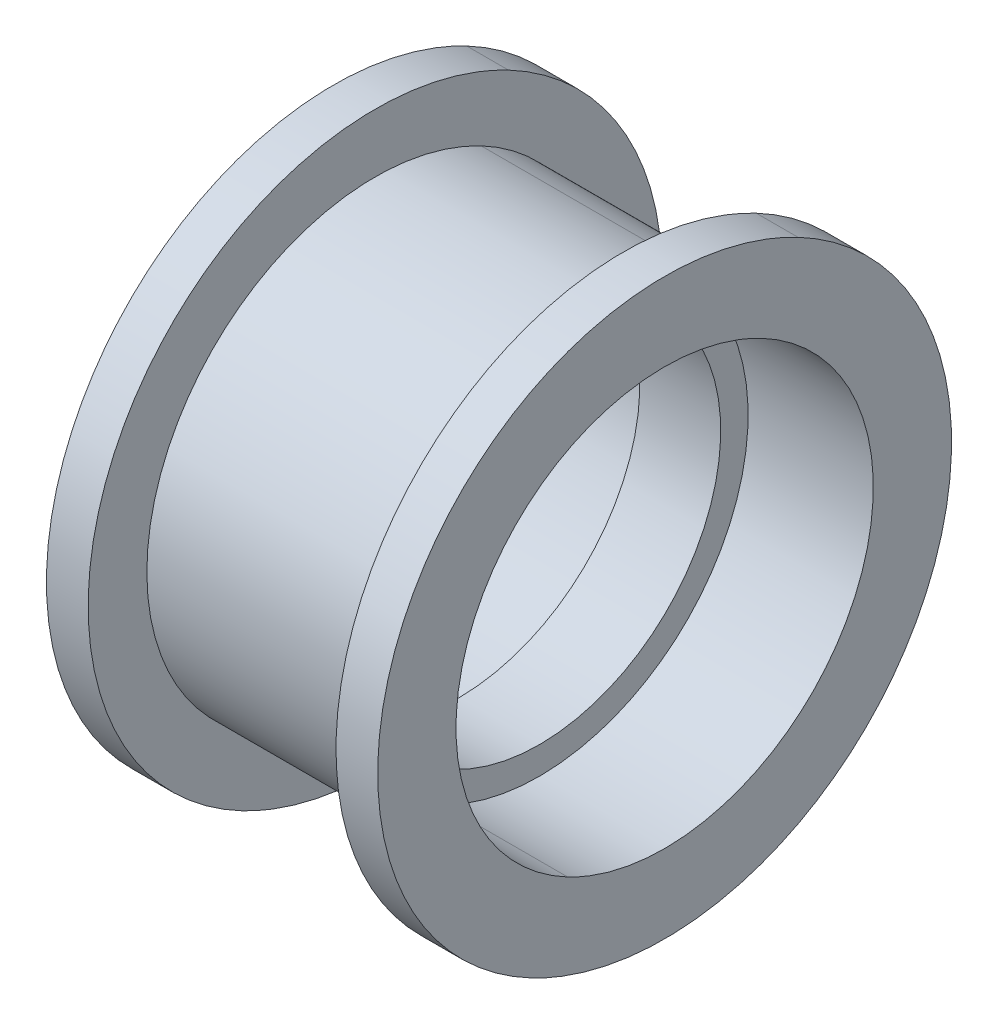
ISO-10303-21;
HEADER;
FILE_DESCRIPTION(('STEP AP214'),'2;1');
FILE_NAME('part.step','',(''),(''),'','','');
FILE_SCHEMA(('AUTOMOTIVE_DESIGN { 1 0 10303 214 1 1 1 1 }'));
ENDSEC;
DATA;
#1=APPLICATION_CONTEXT('core data for automotive mechanical design processes');
#2=APPLICATION_PROTOCOL_DEFINITION('international standard','automotive_design',2000,#1);
#3=PRODUCT_CONTEXT('',#1,'mechanical');
#4=PRODUCT('Part','Part','',(#3));
#5=PRODUCT_RELATED_PRODUCT_CATEGORY('part','',(#4));
#6=PRODUCT_DEFINITION_FORMATION('','',#4);
#7=PRODUCT_DEFINITION_CONTEXT('part definition',#1,'design');
#8=PRODUCT_DEFINITION('design','',#6,#7);
#9=PRODUCT_DEFINITION_SHAPE('','',#8);
#10=(LENGTH_UNIT() NAMED_UNIT(*) SI_UNIT(.MILLI.,.METRE.));
#11=(NAMED_UNIT(*) PLANE_ANGLE_UNIT() SI_UNIT($,.RADIAN.));
#12=(NAMED_UNIT(*) SI_UNIT($,.STERADIAN.) SOLID_ANGLE_UNIT());
#13=UNCERTAINTY_MEASURE_WITH_UNIT(LENGTH_MEASURE(1.E-05),#10,'distance_accuracy_value','');
#14=(GEOMETRIC_REPRESENTATION_CONTEXT(3) GLOBAL_UNCERTAINTY_ASSIGNED_CONTEXT((#13)) GLOBAL_UNIT_ASSIGNED_CONTEXT((#10,
#11,#12)) REPRESENTATION_CONTEXT('',''));
#15=CARTESIAN_POINT('',(0.,0.,0.));
#16=DIRECTION('',(0.,0.,1.));
#17=DIRECTION('',(1.,0.,0.));
#18=AXIS2_PLACEMENT_3D('',#15,#16,#17);
#19=CARTESIAN_POINT('',(195.265281719252,-140.484513661955,253.599848351443));
#20=CARTESIAN_POINT('',(195.265281719252,-136.765971166813,260.683099138463));
#21=CARTESIAN_POINT('',(195.265281719252,-129.682720379793,256.964556643321));
#22=CARTESIAN_POINT('',(195.265281719252,-122.599469592772,253.24601414818));
#23=CARTESIAN_POINT('',(195.265281719252,-126.318012087914,246.162763361159));
#24=CARTESIAN_POINT('',(190.465281719252,-140.484513661955,253.599848351443));
#25=CARTESIAN_POINT('',(190.465281719252,-136.765971166813,260.683099138463));
#26=CARTESIAN_POINT('',(190.465281719252,-129.682720379793,256.964556643321));
#27=CARTESIAN_POINT('',(190.465281719252,-122.599469592772,253.24601414818));
#28=CARTESIAN_POINT('',(190.465281719252,-126.318012087914,246.162763361159));
#29=(BOUNDED_SURFACE() B_SPLINE_SURFACE(1,2,((#19,#20,#21,#22,#23),(#24,#25,#26,#27,#28)),
.UNSPECIFIED.,.F.,.F.,.F.) B_SPLINE_SURFACE_WITH_KNOTS((2,2),(3,2,3),(-6.35,-1.55),
(1.5707963267949,3.14159265358979,4.71238898038469),
.UNSPECIFIED.) GEOMETRIC_REPRESENTATION_ITEM() RATIONAL_B_SPLINE_SURFACE(((1.,0.707106781186548,
1.,0.707106781186548,1.),(1.,0.707106781186548,1.,0.707106781186548,1.))) REPRESENTATION_ITEM('') SURFACE());
#30=CARTESIAN_POINT('',(195.265281719252,-126.318012087914,246.162763361159));
#31=CARTESIAN_POINT('',(190.465281719252,-126.318012087914,246.162763361159));
#32=(BOUNDED_CURVE() B_SPLINE_CURVE(1,(#30,#31),.UNSPECIFIED.,.F.,
.F.) B_SPLINE_CURVE_WITH_KNOTS((2,2),(0.,4.8),
.UNSPECIFIED.) CURVE() GEOMETRIC_REPRESENTATION_ITEM() RATIONAL_B_SPLINE_CURVE((1.,1.)) REPRESENTATION_ITEM(''));
#33=CARTESIAN_POINT('',(195.265281719252,-126.318012087914,246.162763361159));
#34=VERTEX_POINT('',#33);
#35=CARTESIAN_POINT('',(190.465281719252,-126.318012087914,246.162763361159));
#36=VERTEX_POINT('',#35);
#37=EDGE_CURVE('E63',#34,#36,#32,.T.);
#38=CARTESIAN_POINT('',(195.265281719252,-140.484513661955,253.599848351443));
#39=CARTESIAN_POINT('',(195.265281719252,-136.765971166813,260.683099138463));
#40=CARTESIAN_POINT('',(195.265281719252,-129.682720379793,256.964556643321));
#41=CARTESIAN_POINT('',(195.265281719252,-122.599469592772,253.24601414818));
#42=CARTESIAN_POINT('',(195.265281719252,-126.318012087914,246.162763361159));
#43=(BOUNDED_CURVE() B_SPLINE_CURVE(2,(#38,#39,#40,#41,#42),.UNSPECIFIED.,.F.,
.F.) B_SPLINE_CURVE_WITH_KNOTS((3,2,3),(0.,12.5663706143592,25.1327412287183),
.UNSPECIFIED.) CURVE() GEOMETRIC_REPRESENTATION_ITEM() RATIONAL_B_SPLINE_CURVE((1.,
0.707106781186548,1.,0.707106781186548,1.)) REPRESENTATION_ITEM(''));
#44=CARTESIAN_POINT('',(195.265281719252,-140.484513661955,253.599848351443));
#45=VERTEX_POINT('',#44);
#46=EDGE_CURVE('E421',#45,#34,#43,.T.);
#47=CARTESIAN_POINT('',(195.265281719252,-140.484513661955,253.599848351443));
#48=CARTESIAN_POINT('',(190.465281719252,-140.484513661955,253.599848351443));
#49=(BOUNDED_CURVE() B_SPLINE_CURVE(1,(#47,#48),.UNSPECIFIED.,.F.,
.F.) B_SPLINE_CURVE_WITH_KNOTS((2,2),(0.,4.8),
.UNSPECIFIED.) CURVE() GEOMETRIC_REPRESENTATION_ITEM() RATIONAL_B_SPLINE_CURVE((1.,1.)) REPRESENTATION_ITEM(''));
#50=CARTESIAN_POINT('',(190.465281719252,-140.484513661955,253.599848351443));
#51=VERTEX_POINT('',#50);
#52=EDGE_CURVE('E11',#45,#51,#49,.T.);
#53=CARTESIAN_POINT('',(190.465281719252,-140.484513661955,253.599848351443));
#54=CARTESIAN_POINT('',(190.465281719252,-136.765971166813,260.683099138463));
#55=CARTESIAN_POINT('',(190.465281719252,-129.682720379793,256.964556643321));
#56=CARTESIAN_POINT('',(190.465281719252,-122.599469592772,253.24601414818));
#57=CARTESIAN_POINT('',(190.465281719252,-126.318012087914,246.162763361159));
#58=(BOUNDED_CURVE() B_SPLINE_CURVE(2,(#53,#54,#55,#56,#57),.UNSPECIFIED.,.F.,
.F.) B_SPLINE_CURVE_WITH_KNOTS((3,2,3),(0.,12.5663706143592,25.1327412287183),
.UNSPECIFIED.) CURVE() GEOMETRIC_REPRESENTATION_ITEM() RATIONAL_B_SPLINE_CURVE((1.,
0.707106781186548,1.,0.707106781186548,1.)) REPRESENTATION_ITEM(''));
#59=EDGE_CURVE('E452',#51,#36,#58,.T.);
#60=ORIENTED_EDGE('',*,*,#37,.F.);
#61=ORIENTED_EDGE('',*,*,#46,.F.);
#62=ORIENTED_EDGE('',*,*,#52,.T.);
#63=ORIENTED_EDGE('',*,*,#59,.T.);
#64=EDGE_LOOP('',(#60,#61,#62,#63));
#65=FACE_BOUND('',#64,.T.);
#66=ADVANCED_FACE('F51',(#65),#29,.T.);
#67=CARTESIAN_POINT('',(195.265281719252,-143.140732707087,254.994301787121));
#68=CARTESIAN_POINT('',(193.665281719252,-143.140732707087,254.994301787121));
#69=CARTESIAN_POINT('',(195.265281719252,-138.027736776267,264.733771619274));
#70=CARTESIAN_POINT('',(193.665281719252,-138.027736776267,264.733771619274));
#71=CARTESIAN_POINT('',(195.265281719252,-128.288266944114,259.620775688454));
#72=CARTESIAN_POINT('',(193.665281719252,-128.288266944114,259.620775688454));
#73=CARTESIAN_POINT('',(195.265281719252,-118.548797111961,254.507779757634));
#74=CARTESIAN_POINT('',(193.665281719252,-118.548797111961,254.507779757634));
#75=CARTESIAN_POINT('',(195.265281719252,-123.661793042781,244.768309925481));
#76=CARTESIAN_POINT('',(193.665281719252,-123.661793042781,244.768309925481));
#77=(BOUNDED_SURFACE() B_SPLINE_SURFACE(2,1,((#67,#68),(#69,#70),(#71,#72),(#73,#74),(#75,#76)),
.UNSPECIFIED.,.F.,.F.,.F.) B_SPLINE_SURFACE_WITH_KNOTS((3,2,3),(2,2),(1.5707963267949,
3.14159265358979,4.71238898038469),(-6.35,-4.75),
.UNSPECIFIED.) GEOMETRIC_REPRESENTATION_ITEM() RATIONAL_B_SPLINE_SURFACE(((1.,1.),
(0.707106781186548,0.707106781186548),(1.,1.),(0.707106781186548,0.707106781186548),(1.,1.))) REPRESENTATION_ITEM('') SURFACE());
#78=CARTESIAN_POINT('',(195.265281719252,-123.661793042781,244.768309925481));
#79=CARTESIAN_POINT('',(193.665281719252,-123.661793042781,244.768309925481));
#80=(BOUNDED_CURVE() B_SPLINE_CURVE(1,(#78,#79),.UNSPECIFIED.,.F.,
.F.) B_SPLINE_CURVE_WITH_KNOTS((2,2),(0.,1.6),
.UNSPECIFIED.) CURVE() GEOMETRIC_REPRESENTATION_ITEM() RATIONAL_B_SPLINE_CURVE((1.,1.)) REPRESENTATION_ITEM(''));
#81=CARTESIAN_POINT('',(195.265281719252,-123.661793042781,244.768309925481));
#82=VERTEX_POINT('',#81);
#83=CARTESIAN_POINT('',(193.665281719252,-123.661793042781,244.768309925481));
#84=VERTEX_POINT('',#83);
#85=EDGE_CURVE('E388',#82,#84,#80,.T.);
#86=CARTESIAN_POINT('',(193.665281719252,-143.140732707087,254.994301787121));
#87=CARTESIAN_POINT('',(193.665281719252,-138.027736776267,264.733771619274));
#88=CARTESIAN_POINT('',(193.665281719252,-128.288266944114,259.620775688454));
#89=CARTESIAN_POINT('',(193.665281719252,-118.548797111961,254.507779757634));
#90=CARTESIAN_POINT('',(193.665281719252,-123.661793042781,244.768309925481));
#91=(BOUNDED_CURVE() B_SPLINE_CURVE(2,(#86,#87,#88,#89,#90),.UNSPECIFIED.,.F.,
.F.) B_SPLINE_CURVE_WITH_KNOTS((3,2,3),(0.,17.2787595947439,34.5575191894877),
.UNSPECIFIED.) CURVE() GEOMETRIC_REPRESENTATION_ITEM() RATIONAL_B_SPLINE_CURVE((1.,
0.707106781186548,1.,0.707106781186548,1.)) REPRESENTATION_ITEM(''));
#92=CARTESIAN_POINT('',(193.665281719252,-143.140732707087,254.994301787121));
#93=VERTEX_POINT('',#92);
#94=EDGE_CURVE('E362',#93,#84,#91,.T.);
#95=CARTESIAN_POINT('',(195.265281719252,-143.140732707087,254.994301787121));
#96=CARTESIAN_POINT('',(193.665281719252,-143.140732707087,254.994301787121));
#97=(BOUNDED_CURVE() B_SPLINE_CURVE(1,(#95,#96),.UNSPECIFIED.,.F.,
.F.) B_SPLINE_CURVE_WITH_KNOTS((2,2),(0.,1.6),
.UNSPECIFIED.) CURVE() GEOMETRIC_REPRESENTATION_ITEM() RATIONAL_B_SPLINE_CURVE((1.,1.)) REPRESENTATION_ITEM(''));
#98=CARTESIAN_POINT('',(195.265281719252,-143.140732707087,254.994301787121));
#99=VERTEX_POINT('',#98);
#100=EDGE_CURVE('E405',#99,#93,#97,.T.);
#101=CARTESIAN_POINT('',(195.265281719252,-143.140732707087,254.994301787121));
#102=CARTESIAN_POINT('',(195.265281719252,-138.027736776267,264.733771619274));
#103=CARTESIAN_POINT('',(195.265281719252,-128.288266944114,259.620775688454));
#104=CARTESIAN_POINT('',(195.265281719252,-118.548797111961,254.507779757634));
#105=CARTESIAN_POINT('',(195.265281719252,-123.661793042781,244.768309925481));
#106=(BOUNDED_CURVE() B_SPLINE_CURVE(2,(#101,#102,#103,#104,#105),.UNSPECIFIED.,.F.,
.F.) B_SPLINE_CURVE_WITH_KNOTS((3,2,3),(0.,17.2787595947439,34.5575191894877),
.UNSPECIFIED.) CURVE() GEOMETRIC_REPRESENTATION_ITEM() RATIONAL_B_SPLINE_CURVE((1.,
0.707106781186548,1.,0.707106781186548,1.)) REPRESENTATION_ITEM(''));
#107=EDGE_CURVE('E413',#99,#82,#106,.T.);
#108=ORIENTED_EDGE('',*,*,#85,.T.);
#109=ORIENTED_EDGE('',*,*,#94,.F.);
#110=ORIENTED_EDGE('',*,*,#100,.F.);
#111=ORIENTED_EDGE('',*,*,#107,.T.);
#112=EDGE_LOOP('',(#108,#109,#110,#111));
#113=FACE_BOUND('',#112,.T.);
#114=ADVANCED_FACE('F496',(#113),#77,.T.);
#115=CARTESIAN_POINT('',(193.665281719252,-141.148568423238,253.948461710362));
#116=CARTESIAN_POINT('',(184.165281719252,-141.148568423238,253.948461710362));
#117=CARTESIAN_POINT('',(193.665281719252,-137.081412569177,261.695767258666));
#118=CARTESIAN_POINT('',(184.165281719252,-137.081412569177,261.695767258666));
#119=CARTESIAN_POINT('',(193.665281719252,-129.334107020873,257.628611404605));
#120=CARTESIAN_POINT('',(184.165281719252,-129.334107020873,257.628611404605));
#121=CARTESIAN_POINT('',(193.665281719252,-121.586801472569,253.561455550543));
#122=CARTESIAN_POINT('',(184.165281719252,-121.586801472569,253.561455550543));
#123=CARTESIAN_POINT('',(193.665281719252,-125.653957326631,245.81415000224));
#124=CARTESIAN_POINT('',(184.165281719252,-125.653957326631,245.81415000224));
#125=(BOUNDED_SURFACE() B_SPLINE_SURFACE(2,1,((#115,#116),(#117,#118),(#119,#120),(#121,#122),
(#123,#124)),.UNSPECIFIED.,.F.,.F.,.F.) B_SPLINE_SURFACE_WITH_KNOTS((3,2,3),(2,2),
(1.5707963267949,3.14159265358979,4.71238898038469),(-4.75,4.75),
.UNSPECIFIED.) GEOMETRIC_REPRESENTATION_ITEM() RATIONAL_B_SPLINE_SURFACE(((1.,1.),
(0.707106781186548,0.707106781186548),(1.,1.),(0.707106781186548,0.707106781186548),(1.,1.))) REPRESENTATION_ITEM('') SURFACE());
#126=CARTESIAN_POINT('',(193.665281719252,-125.653957326631,245.81415000224));
#127=CARTESIAN_POINT('',(184.165281719252,-125.653957326631,245.81415000224));
#128=(BOUNDED_CURVE() B_SPLINE_CURVE(1,(#126,#127),.UNSPECIFIED.,.F.,
.F.) B_SPLINE_CURVE_WITH_KNOTS((2,2),(0.,9.5),
.UNSPECIFIED.) CURVE() GEOMETRIC_REPRESENTATION_ITEM() RATIONAL_B_SPLINE_CURVE((1.,1.)) REPRESENTATION_ITEM(''));
#129=CARTESIAN_POINT('',(193.665281719252,-125.653957326631,245.81415000224));
#130=VERTEX_POINT('',#129);
#131=CARTESIAN_POINT('',(184.165281719252,-125.653957326631,245.81415000224));
#132=VERTEX_POINT('',#131);
#133=EDGE_CURVE('E330',#130,#132,#128,.T.);
#134=CARTESIAN_POINT('',(184.165281719252,-141.148568423238,253.948461710362));
#135=CARTESIAN_POINT('',(184.165281719252,-137.081412569177,261.695767258666));
#136=CARTESIAN_POINT('',(184.165281719252,-129.334107020873,257.628611404605));
#137=CARTESIAN_POINT('',(184.165281719252,-121.586801472569,253.561455550543));
#138=CARTESIAN_POINT('',(184.165281719252,-125.653957326631,245.81415000224));
#139=(BOUNDED_CURVE() B_SPLINE_CURVE(2,(#134,#135,#136,#137,#138),.UNSPECIFIED.,.F.,
.F.) B_SPLINE_CURVE_WITH_KNOTS((3,2,3),(0.,13.7444678594553,27.4889357189107),
.UNSPECIFIED.) CURVE() GEOMETRIC_REPRESENTATION_ITEM() RATIONAL_B_SPLINE_CURVE((1.,
0.707106781186548,1.,0.707106781186548,1.)) REPRESENTATION_ITEM(''));
#140=CARTESIAN_POINT('',(184.165281719252,-141.148568423238,253.948461710362));
#141=VERTEX_POINT('',#140);
#142=EDGE_CURVE('E215',#141,#132,#139,.T.);
#143=CARTESIAN_POINT('',(193.665281719252,-141.148568423238,253.948461710362));
#144=CARTESIAN_POINT('',(184.165281719252,-141.148568423238,253.948461710362));
#145=(BOUNDED_CURVE() B_SPLINE_CURVE(1,(#143,#144),.UNSPECIFIED.,.F.,
.F.) B_SPLINE_CURVE_WITH_KNOTS((2,2),(0.,9.5),
.UNSPECIFIED.) CURVE() GEOMETRIC_REPRESENTATION_ITEM() RATIONAL_B_SPLINE_CURVE((1.,1.)) REPRESENTATION_ITEM(''));
#146=CARTESIAN_POINT('',(193.665281719252,-141.148568423238,253.948461710362));
#147=VERTEX_POINT('',#146);
#148=EDGE_CURVE('E329',#147,#141,#145,.T.);
#149=CARTESIAN_POINT('',(193.665281719252,-141.148568423238,253.948461710362));
#150=CARTESIAN_POINT('',(193.665281719252,-137.081412569177,261.695767258666));
#151=CARTESIAN_POINT('',(193.665281719252,-129.334107020873,257.628611404605));
#152=CARTESIAN_POINT('',(193.665281719252,-121.586801472569,253.561455550543));
#153=CARTESIAN_POINT('',(193.665281719252,-125.653957326631,245.81415000224));
#154=(BOUNDED_CURVE() B_SPLINE_CURVE(2,(#149,#150,#151,#152,#153),.UNSPECIFIED.,.F.,
.F.) B_SPLINE_CURVE_WITH_KNOTS((3,2,3),(0.,13.7444678594553,27.4889357189107),
.UNSPECIFIED.) CURVE() GEOMETRIC_REPRESENTATION_ITEM() RATIONAL_B_SPLINE_CURVE((1.,
0.707106781186548,1.,0.707106781186548,1.)) REPRESENTATION_ITEM(''));
#155=EDGE_CURVE('E380',#147,#130,#154,.T.);
#156=ORIENTED_EDGE('',*,*,#133,.T.);
#157=ORIENTED_EDGE('',*,*,#142,.F.);
#158=ORIENTED_EDGE('',*,*,#148,.F.);
#159=ORIENTED_EDGE('',*,*,#155,.T.);
#160=EDGE_LOOP('',(#156,#157,#158,#159));
#161=FACE_BOUND('',#160,.T.);
#162=ADVANCED_FACE('F501',(#161),#125,.T.);
#163=CARTESIAN_POINT('',(184.165281719252,-143.140732707087,254.994301787121));
#164=CARTESIAN_POINT('',(182.565281719252,-143.140732707087,254.994301787121));
#165=CARTESIAN_POINT('',(184.165281719252,-138.027736776267,264.733771619274));
#166=CARTESIAN_POINT('',(182.565281719252,-138.027736776267,264.733771619274));
#167=CARTESIAN_POINT('',(184.165281719252,-128.288266944114,259.620775688454));
#168=CARTESIAN_POINT('',(182.565281719252,-128.288266944114,259.620775688454));
#169=CARTESIAN_POINT('',(184.165281719252,-118.548797111961,254.507779757634));
#170=CARTESIAN_POINT('',(182.565281719252,-118.548797111961,254.507779757634));
#171=CARTESIAN_POINT('',(184.165281719252,-123.661793042781,244.768309925481));
#172=CARTESIAN_POINT('',(182.565281719252,-123.661793042781,244.768309925481));
#173=(BOUNDED_SURFACE() B_SPLINE_SURFACE(2,1,((#163,#164),(#165,#166),(#167,#168),(#169,#170),
(#171,#172)),.UNSPECIFIED.,.F.,.F.,.F.) B_SPLINE_SURFACE_WITH_KNOTS((3,2,3),(2,2),
(1.5707963267949,3.14159265358979,4.71238898038469),(4.75,6.35),
.UNSPECIFIED.) GEOMETRIC_REPRESENTATION_ITEM() RATIONAL_B_SPLINE_SURFACE(((1.,1.),
(0.707106781186548,0.707106781186548),(1.,1.),(0.707106781186548,0.707106781186548),(1.,1.))) REPRESENTATION_ITEM('') SURFACE());
#174=CARTESIAN_POINT('',(184.165281719252,-123.661793042781,244.768309925481));
#175=CARTESIAN_POINT('',(182.565281719252,-123.661793042781,244.768309925481));
#176=(BOUNDED_CURVE() B_SPLINE_CURVE(1,(#174,#175),.UNSPECIFIED.,.F.,
.F.) B_SPLINE_CURVE_WITH_KNOTS((2,2),(0.,1.6),
.UNSPECIFIED.) CURVE() GEOMETRIC_REPRESENTATION_ITEM() RATIONAL_B_SPLINE_CURVE((1.,1.)) REPRESENTATION_ITEM(''));
#177=CARTESIAN_POINT('',(184.165281719252,-123.661793042781,244.768309925481));
#178=VERTEX_POINT('',#177);
#179=CARTESIAN_POINT('',(182.565281719252,-123.661793042781,244.768309925481));
#180=VERTEX_POINT('',#179);
#181=EDGE_CURVE('E244',#178,#180,#176,.T.);
#182=CARTESIAN_POINT('',(182.565281719252,-143.140732707087,254.994301787121));
#183=CARTESIAN_POINT('',(182.565281719252,-138.027736776267,264.733771619274));
#184=CARTESIAN_POINT('',(182.565281719252,-128.288266944114,259.620775688454));
#185=CARTESIAN_POINT('',(182.565281719252,-118.548797111961,254.507779757634));
#186=CARTESIAN_POINT('',(182.565281719252,-123.661793042781,244.768309925481));
#187=(BOUNDED_CURVE() B_SPLINE_CURVE(2,(#182,#183,#184,#185,#186),.UNSPECIFIED.,.F.,
.F.) B_SPLINE_CURVE_WITH_KNOTS((3,2,3),(0.,17.2787595947439,34.5575191894877),
.UNSPECIFIED.) CURVE() GEOMETRIC_REPRESENTATION_ITEM() RATIONAL_B_SPLINE_CURVE((1.,
0.707106781186548,1.,0.707106781186548,1.)) REPRESENTATION_ITEM(''));
#188=CARTESIAN_POINT('',(182.565281719252,-143.140732707087,254.994301787121));
#189=VERTEX_POINT('',#188);
#190=EDGE_CURVE('E280',#189,#180,#187,.T.);
#191=CARTESIAN_POINT('',(184.165281719252,-143.140732707087,254.994301787121));
#192=CARTESIAN_POINT('',(182.565281719252,-143.140732707087,254.994301787121));
#193=(BOUNDED_CURVE() B_SPLINE_CURVE(1,(#191,#192),.UNSPECIFIED.,.F.,
.F.) B_SPLINE_CURVE_WITH_KNOTS((2,2),(0.,1.6),
.UNSPECIFIED.) CURVE() GEOMETRIC_REPRESENTATION_ITEM() RATIONAL_B_SPLINE_CURVE((1.,1.)) REPRESENTATION_ITEM(''));
#194=CARTESIAN_POINT('',(184.165281719252,-143.140732707087,254.994301787121));
#195=VERTEX_POINT('',#194);
#196=EDGE_CURVE('E216',#195,#189,#193,.T.);
#197=CARTESIAN_POINT('',(184.165281719252,-143.140732707087,254.994301787121));
#198=CARTESIAN_POINT('',(184.165281719252,-138.027736776267,264.733771619274));
#199=CARTESIAN_POINT('',(184.165281719252,-128.288266944114,259.620775688454));
#200=CARTESIAN_POINT('',(184.165281719252,-118.548797111961,254.507779757634));
#201=CARTESIAN_POINT('',(184.165281719252,-123.661793042781,244.768309925481));
#202=(BOUNDED_CURVE() B_SPLINE_CURVE(2,(#197,#198,#199,#200,#201),.UNSPECIFIED.,.F.,
.F.) B_SPLINE_CURVE_WITH_KNOTS((3,2,3),(0.,17.2787595947439,34.5575191894877),
.UNSPECIFIED.) CURVE() GEOMETRIC_REPRESENTATION_ITEM() RATIONAL_B_SPLINE_CURVE((1.,
0.707106781186548,1.,0.707106781186548,1.)) REPRESENTATION_ITEM(''));
#203=EDGE_CURVE('E208',#195,#178,#202,.T.);
#204=ORIENTED_EDGE('',*,*,#181,.T.);
#205=ORIENTED_EDGE('',*,*,#190,.F.);
#206=ORIENTED_EDGE('',*,*,#196,.F.);
#207=ORIENTED_EDGE('',*,*,#203,.T.);
#208=EDGE_LOOP('',(#204,#205,#206,#207));
#209=FACE_BOUND('',#208,.T.);
#210=ADVANCED_FACE('F507',(#209),#173,.T.);
#211=CARTESIAN_POINT('',(187.365281719252,-140.484513661955,253.599848351443));
#212=CARTESIAN_POINT('',(187.365281719252,-136.765971166813,260.683099138463));
#213=CARTESIAN_POINT('',(187.365281719252,-129.682720379793,256.964556643321));
#214=CARTESIAN_POINT('',(187.365281719252,-122.599469592772,253.24601414818));
#215=CARTESIAN_POINT('',(187.365281719252,-126.318012087914,246.162763361159));
#216=CARTESIAN_POINT('',(182.565281719252,-140.484513661955,253.599848351443));
#217=CARTESIAN_POINT('',(182.565281719252,-136.765971166813,260.683099138463));
#218=CARTESIAN_POINT('',(182.565281719252,-129.682720379793,256.964556643321));
#219=CARTESIAN_POINT('',(182.565281719252,-122.599469592772,253.24601414818));
#220=CARTESIAN_POINT('',(182.565281719252,-126.318012087914,246.162763361159));
#221=(BOUNDED_SURFACE() B_SPLINE_SURFACE(1,2,((#211,#212,#213,#214,#215),(#216,#217,#218,#219,
#220)),.UNSPECIFIED.,.F.,.F.,.F.) B_SPLINE_SURFACE_WITH_KNOTS((2,2),(3,2,3),(1.55,6.35),
(1.5707963267949,3.14159265358979,4.71238898038469),
.UNSPECIFIED.) GEOMETRIC_REPRESENTATION_ITEM() RATIONAL_B_SPLINE_SURFACE(((1.,0.707106781186548,
1.,0.707106781186548,1.),(1.,0.707106781186548,1.,0.707106781186548,1.))) REPRESENTATION_ITEM('') SURFACE());
#222=CARTESIAN_POINT('',(187.365281719252,-126.318012087914,246.162763361159));
#223=CARTESIAN_POINT('',(182.565281719252,-126.318012087914,246.162763361159));
#224=(BOUNDED_CURVE() B_SPLINE_CURVE(1,(#222,#223),.UNSPECIFIED.,.F.,
.F.) B_SPLINE_CURVE_WITH_KNOTS((2,2),(0.,4.8),
.UNSPECIFIED.) CURVE() GEOMETRIC_REPRESENTATION_ITEM() RATIONAL_B_SPLINE_CURVE((1.,1.)) REPRESENTATION_ITEM(''));
#225=CARTESIAN_POINT('',(187.365281719252,-126.318012087914,246.162763361159));
#226=VERTEX_POINT('',#225);
#227=CARTESIAN_POINT('',(182.565281719252,-126.318012087914,246.162763361159));
#228=VERTEX_POINT('',#227);
#229=EDGE_CURVE('E179',#226,#228,#224,.T.);
#230=CARTESIAN_POINT('',(187.365281719252,-140.484513661955,253.599848351443));
#231=CARTESIAN_POINT('',(187.365281719252,-136.765971166813,260.683099138463));
#232=CARTESIAN_POINT('',(187.365281719252,-129.682720379793,256.964556643321));
#233=CARTESIAN_POINT('',(187.365281719252,-122.599469592772,253.24601414818));
#234=CARTESIAN_POINT('',(187.365281719252,-126.318012087914,246.162763361159));
#235=(BOUNDED_CURVE() B_SPLINE_CURVE(2,(#230,#231,#232,#233,#234),.UNSPECIFIED.,.F.,
.F.) B_SPLINE_CURVE_WITH_KNOTS((3,2,3),(0.,12.5663706143592,25.1327412287183),
.UNSPECIFIED.) CURVE() GEOMETRIC_REPRESENTATION_ITEM() RATIONAL_B_SPLINE_CURVE((1.,
0.707106781186548,1.,0.707106781186548,1.)) REPRESENTATION_ITEM(''));
#236=CARTESIAN_POINT('',(187.365281719252,-140.484513661955,253.599848351443));
#237=VERTEX_POINT('',#236);
#238=EDGE_CURVE('E191',#237,#226,#235,.T.);
#239=CARTESIAN_POINT('',(187.365281719252,-140.484513661955,253.599848351443));
#240=CARTESIAN_POINT('',(182.565281719252,-140.484513661955,253.599848351443));
#241=(BOUNDED_CURVE() B_SPLINE_CURVE(1,(#239,#240),.UNSPECIFIED.,.F.,
.F.) B_SPLINE_CURVE_WITH_KNOTS((2,2),(0.,4.8),
.UNSPECIFIED.) CURVE() GEOMETRIC_REPRESENTATION_ITEM() RATIONAL_B_SPLINE_CURVE((1.,1.)) REPRESENTATION_ITEM(''));
#242=CARTESIAN_POINT('',(182.565281719252,-140.484513661955,253.599848351443));
#243=VERTEX_POINT('',#242);
#244=EDGE_CURVE('E271',#237,#243,#241,.T.);
#245=CARTESIAN_POINT('',(182.565281719252,-140.484513661955,253.599848351443));
#246=CARTESIAN_POINT('',(182.565281719252,-136.765971166813,260.683099138463));
#247=CARTESIAN_POINT('',(182.565281719252,-129.682720379793,256.964556643321));
#248=CARTESIAN_POINT('',(182.565281719252,-122.599469592772,253.24601414818));
#249=CARTESIAN_POINT('',(182.565281719252,-126.318012087914,246.162763361159));
#250=(BOUNDED_CURVE() B_SPLINE_CURVE(2,(#245,#246,#247,#248,#249),.UNSPECIFIED.,.F.,
.F.) B_SPLINE_CURVE_WITH_KNOTS((3,2,3),(0.,12.5663706143592,25.1327412287183),
.UNSPECIFIED.) CURVE() GEOMETRIC_REPRESENTATION_ITEM() RATIONAL_B_SPLINE_CURVE((1.,
0.707106781186548,1.,0.707106781186548,1.)) REPRESENTATION_ITEM(''));
#251=EDGE_CURVE('E236',#243,#228,#250,.T.);
#252=ORIENTED_EDGE('',*,*,#229,.F.);
#253=ORIENTED_EDGE('',*,*,#238,.F.);
#254=ORIENTED_EDGE('',*,*,#244,.T.);
#255=ORIENTED_EDGE('',*,*,#251,.T.);
#256=EDGE_LOOP('',(#252,#253,#254,#255));
#257=FACE_BOUND('',#256,.T.);
#258=ADVANCED_FACE('F529',(#257),#221,.T.);
#259=CARTESIAN_POINT('',(190.465281719252,-139.554836996158,253.111789648955));
#260=CARTESIAN_POINT('',(190.465281719252,-136.324353203504,259.265363770179));
#261=CARTESIAN_POINT('',(190.465281719252,-130.17077908228,256.034879977525));
#262=CARTESIAN_POINT('',(190.465281719252,-124.017204961056,252.804396184871));
#263=CARTESIAN_POINT('',(190.465281719252,-127.24768875371,246.650822063647));
#264=CARTESIAN_POINT('',(187.365281719252,-139.554836996158,253.111789648955));
#265=CARTESIAN_POINT('',(187.365281719252,-136.324353203504,259.265363770179));
#266=CARTESIAN_POINT('',(187.365281719252,-130.17077908228,256.034879977525));
#267=CARTESIAN_POINT('',(187.365281719252,-124.017204961056,252.804396184871));
#268=CARTESIAN_POINT('',(187.365281719252,-127.24768875371,246.650822063647));
#269=(BOUNDED_SURFACE() B_SPLINE_SURFACE(1,2,((#259,#260,#261,#262,#263),(#264,#265,#266,#267,
#268)),.UNSPECIFIED.,.F.,.F.,.F.) B_SPLINE_SURFACE_WITH_KNOTS((2,2),(3,2,3),(-1.55,1.55),
(1.5707963267949,3.14159265358979,4.71238898038469),
.UNSPECIFIED.) GEOMETRIC_REPRESENTATION_ITEM() RATIONAL_B_SPLINE_SURFACE(((1.,0.707106781186548,
1.,0.707106781186548,1.),(1.,0.707106781186548,1.,0.707106781186548,1.))) REPRESENTATION_ITEM('') SURFACE());
#270=CARTESIAN_POINT('',(190.465281719252,-127.24768875371,246.650822063647));
#271=CARTESIAN_POINT('',(187.365281719252,-127.24768875371,246.650822063647));
#272=(BOUNDED_CURVE() B_SPLINE_CURVE(1,(#270,#271),.UNSPECIFIED.,.F.,
.F.) B_SPLINE_CURVE_WITH_KNOTS((2,2),(0.,3.1),
.UNSPECIFIED.) CURVE() GEOMETRIC_REPRESENTATION_ITEM() RATIONAL_B_SPLINE_CURVE((1.,1.)) REPRESENTATION_ITEM(''));
#273=CARTESIAN_POINT('',(190.465281719252,-127.24768875371,246.650822063647));
#274=VERTEX_POINT('',#273);
#275=CARTESIAN_POINT('',(187.365281719252,-127.24768875371,246.650822063647));
#276=VERTEX_POINT('',#275);
#277=EDGE_CURVE('E194',#274,#276,#272,.T.);
#278=CARTESIAN_POINT('',(190.465281719252,-139.554836996158,253.111789648955));
#279=CARTESIAN_POINT('',(190.465281719252,-136.324353203504,259.265363770179));
#280=CARTESIAN_POINT('',(190.465281719252,-130.17077908228,256.034879977525));
#281=CARTESIAN_POINT('',(190.465281719252,-124.017204961056,252.804396184871));
#282=CARTESIAN_POINT('',(190.465281719252,-127.24768875371,246.650822063647));
#283=(BOUNDED_CURVE() B_SPLINE_CURVE(2,(#278,#279,#280,#281,#282),.UNSPECIFIED.,.F.,
.F.) B_SPLINE_CURVE_WITH_KNOTS((3,2,3),(0.,10.9170344712245,21.8340689424491),
.UNSPECIFIED.) CURVE() GEOMETRIC_REPRESENTATION_ITEM() RATIONAL_B_SPLINE_CURVE((1.,
0.707106781186548,1.,0.707106781186548,1.)) REPRESENTATION_ITEM(''));
#284=CARTESIAN_POINT('',(190.465281719252,-139.554836996158,253.111789648955));
#285=VERTEX_POINT('',#284);
#286=EDGE_CURVE('E186',#285,#274,#283,.T.);
#287=CARTESIAN_POINT('',(190.465281719252,-139.554836996158,253.111789648955));
#288=CARTESIAN_POINT('',(187.365281719252,-139.554836996158,253.111789648955));
#289=(BOUNDED_CURVE() B_SPLINE_CURVE(1,(#287,#288),.UNSPECIFIED.,.F.,
.F.) B_SPLINE_CURVE_WITH_KNOTS((2,2),(0.,3.1),
.UNSPECIFIED.) CURVE() GEOMETRIC_REPRESENTATION_ITEM() RATIONAL_B_SPLINE_CURVE((1.,1.)) REPRESENTATION_ITEM(''));
#290=CARTESIAN_POINT('',(187.365281719252,-139.554836996158,253.111789648955));
#291=VERTEX_POINT('',#290);
#292=EDGE_CURVE('E183',#285,#291,#289,.T.);
#293=CARTESIAN_POINT('',(187.365281719252,-139.554836996158,253.111789648955));
#294=CARTESIAN_POINT('',(187.365281719252,-136.324353203504,259.265363770179));
#295=CARTESIAN_POINT('',(187.365281719252,-130.17077908228,256.034879977525));
#296=CARTESIAN_POINT('',(187.365281719252,-124.017204961056,252.804396184871));
#297=CARTESIAN_POINT('',(187.365281719252,-127.24768875371,246.650822063647));
#298=(BOUNDED_CURVE() B_SPLINE_CURVE(2,(#293,#294,#295,#296,#297),.UNSPECIFIED.,.F.,
.F.) B_SPLINE_CURVE_WITH_KNOTS((3,2,3),(0.,10.9170344712245,21.8340689424491),
.UNSPECIFIED.) CURVE() GEOMETRIC_REPRESENTATION_ITEM() RATIONAL_B_SPLINE_CURVE((1.,
0.707106781186548,1.,0.707106781186548,1.)) REPRESENTATION_ITEM(''));
#299=EDGE_CURVE('E170',#291,#276,#298,.T.);
#300=ORIENTED_EDGE('',*,*,#277,.F.);
#301=ORIENTED_EDGE('',*,*,#286,.F.);
#302=ORIENTED_EDGE('',*,*,#292,.T.);
#303=ORIENTED_EDGE('',*,*,#299,.T.);
#304=EDGE_LOOP('',(#300,#301,#302,#303));
#305=FACE_BOUND('',#304,.T.);
#306=ADVANCED_FACE('F184',(#305),#269,.T.);
#307=CARTESIAN_POINT('',(195.265281719252,-126.318012087914,246.162763361159));
#308=CARTESIAN_POINT('',(195.265281719252,-130.036554583056,239.079512574139));
#309=CARTESIAN_POINT('',(195.265281719252,-137.119805370076,242.798055069281));
#310=CARTESIAN_POINT('',(195.265281719252,-144.203056157096,246.516597564422));
#311=CARTESIAN_POINT('',(195.265281719252,-140.484513661955,253.599848351443));
#312=CARTESIAN_POINT('',(190.465281719252,-126.318012087914,246.162763361159));
#313=CARTESIAN_POINT('',(190.465281719252,-130.036554583056,239.079512574139));
#314=CARTESIAN_POINT('',(190.465281719252,-137.119805370076,242.798055069281));
#315=CARTESIAN_POINT('',(190.465281719252,-144.203056157096,246.516597564422));
#316=CARTESIAN_POINT('',(190.465281719252,-140.484513661955,253.599848351443));
#317=(BOUNDED_SURFACE() B_SPLINE_SURFACE(1,2,((#307,#308,#309,#310,#311),(#312,#313,#314,#315,
#316)),.UNSPECIFIED.,.F.,.F.,.F.) B_SPLINE_SURFACE_WITH_KNOTS((2,2),(3,2,3),(-6.35,-1.55),
(1.5707963267949,3.14159265358979,4.71238898038469),
.UNSPECIFIED.) GEOMETRIC_REPRESENTATION_ITEM() RATIONAL_B_SPLINE_SURFACE(((1.,0.707106781186548,
1.,0.707106781186548,1.),(1.,0.707106781186548,1.,0.707106781186548,1.))) REPRESENTATION_ITEM('') SURFACE());
#318=CARTESIAN_POINT('',(190.465281719252,-126.318012087914,246.162763361159));
#319=CARTESIAN_POINT('',(190.465281719252,-130.036554583056,239.079512574139));
#320=CARTESIAN_POINT('',(190.465281719252,-137.119805370076,242.798055069281));
#321=CARTESIAN_POINT('',(190.465281719252,-144.203056157096,246.516597564422));
#322=CARTESIAN_POINT('',(190.465281719252,-140.484513661955,253.599848351443));
#323=(BOUNDED_CURVE() B_SPLINE_CURVE(2,(#318,#319,#320,#321,#322),.UNSPECIFIED.,.F.,
.F.) B_SPLINE_CURVE_WITH_KNOTS((3,2,3),(0.,12.5663706143592,25.1327412287184),
.UNSPECIFIED.) CURVE() GEOMETRIC_REPRESENTATION_ITEM() RATIONAL_B_SPLINE_CURVE((1.,
0.707106781186547,1.,0.707106781186547,1.)) REPRESENTATION_ITEM(''));
#324=EDGE_CURVE('E450',#36,#51,#323,.T.);
#325=CARTESIAN_POINT('',(195.265281719252,-126.318012087914,246.162763361159));
#326=CARTESIAN_POINT('',(195.265281719252,-130.036554583056,239.079512574139));
#327=CARTESIAN_POINT('',(195.265281719252,-137.119805370076,242.798055069281));
#328=CARTESIAN_POINT('',(195.265281719252,-144.203056157096,246.516597564422));
#329=CARTESIAN_POINT('',(195.265281719252,-140.484513661955,253.599848351443));
#330=(BOUNDED_CURVE() B_SPLINE_CURVE(2,(#325,#326,#327,#328,#329),.UNSPECIFIED.,.F.,
.F.) B_SPLINE_CURVE_WITH_KNOTS((3,2,3),(0.,12.5663706143592,25.1327412287184),
.UNSPECIFIED.) CURVE() GEOMETRIC_REPRESENTATION_ITEM() RATIONAL_B_SPLINE_CURVE((1.,
0.707106781186547,1.,0.707106781186547,1.)) REPRESENTATION_ITEM(''));
#331=EDGE_CURVE('E430',#34,#45,#330,.T.);
#332=ORIENTED_EDGE('',*,*,#37,.T.);
#333=ORIENTED_EDGE('',*,*,#324,.T.);
#334=ORIENTED_EDGE('',*,*,#52,.F.);
#335=ORIENTED_EDGE('',*,*,#331,.F.);
#336=EDGE_LOOP('',(#332,#333,#334,#335));
#337=FACE_BOUND('',#336,.T.);
#338=ADVANCED_FACE('F448',(#337),#317,.T.);
#339=CARTESIAN_POINT('',(195.265281719252,-148.253728637907,245.254831954968));
#340=DIRECTION('',(1.,0.,0.));
#341=DIRECTION('',(0.,1.,0.));
#342=AXIS2_PLACEMENT_3D('',#339,#340,#341);
#343=PLANE('',#342);
#344=ORIENTED_EDGE('',*,*,#46,.T.);
#345=ORIENTED_EDGE('',*,*,#331,.T.);
#346=EDGE_LOOP('',(#344,#345));
#347=FACE_BOUND('',#346,.T.);
#348=CARTESIAN_POINT('',(195.265281719252,-123.661793042781,244.768309925481));
#349=CARTESIAN_POINT('',(195.265281719252,-128.774788973601,235.028840093328));
#350=CARTESIAN_POINT('',(195.265281719252,-138.514258805754,240.141836024148));
#351=CARTESIAN_POINT('',(195.265281719252,-148.253728637907,245.254831954968));
#352=CARTESIAN_POINT('',(195.265281719252,-143.140732707087,254.994301787121));
#353=(BOUNDED_CURVE() B_SPLINE_CURVE(2,(#348,#349,#350,#351,#352),.UNSPECIFIED.,.F.,
.F.) B_SPLINE_CURVE_WITH_KNOTS((3,2,3),(0.,17.2787595947439,34.5575191894877),
.UNSPECIFIED.) CURVE() GEOMETRIC_REPRESENTATION_ITEM() RATIONAL_B_SPLINE_CURVE((1.,
0.707106781186547,1.,0.707106781186547,1.)) REPRESENTATION_ITEM(''));
#354=EDGE_CURVE('E396',#82,#99,#353,.T.);
#355=ORIENTED_EDGE('',*,*,#354,.F.);
#356=ORIENTED_EDGE('',*,*,#107,.F.);
#357=EDGE_LOOP('',(#355,#356));
#358=FACE_BOUND('',#357,.T.);
#359=ADVANCED_FACE('F540',(#347,#358),#343,.T.);
#360=CARTESIAN_POINT('',(195.265281719252,-123.661793042781,244.768309925481));
#361=CARTESIAN_POINT('',(193.665281719252,-123.661793042781,244.768309925481));
#362=CARTESIAN_POINT('',(195.265281719252,-128.774788973601,235.028840093328));
#363=CARTESIAN_POINT('',(193.665281719252,-128.774788973601,235.028840093328));
#364=CARTESIAN_POINT('',(195.265281719252,-138.514258805754,240.141836024148));
#365=CARTESIAN_POINT('',(193.665281719252,-138.514258805754,240.141836024148));
#366=CARTESIAN_POINT('',(195.265281719252,-148.253728637907,245.254831954968));
#367=CARTESIAN_POINT('',(193.665281719252,-148.253728637907,245.254831954968));
#368=CARTESIAN_POINT('',(195.265281719252,-143.140732707087,254.994301787121));
#369=CARTESIAN_POINT('',(193.665281719252,-143.140732707087,254.994301787121));
#370=(BOUNDED_SURFACE() B_SPLINE_SURFACE(2,1,((#360,#361),(#362,#363),(#364,#365),(#366,#367),
(#368,#369)),.UNSPECIFIED.,.F.,.F.,.F.) B_SPLINE_SURFACE_WITH_KNOTS((3,2,3),(2,2),
(1.5707963267949,3.14159265358979,4.71238898038469),(-6.35,-4.75),
.UNSPECIFIED.) GEOMETRIC_REPRESENTATION_ITEM() RATIONAL_B_SPLINE_SURFACE(((1.,1.),
(0.707106781186548,0.707106781186548),(1.,1.),(0.707106781186548,0.707106781186548),(1.,1.))) REPRESENTATION_ITEM('') SURFACE());
#371=CARTESIAN_POINT('',(193.665281719252,-123.661793042781,244.768309925481));
#372=CARTESIAN_POINT('',(193.665281719252,-128.774788973601,235.028840093328));
#373=CARTESIAN_POINT('',(193.665281719252,-138.514258805754,240.141836024148));
#374=CARTESIAN_POINT('',(193.665281719252,-148.253728637907,245.254831954968));
#375=CARTESIAN_POINT('',(193.665281719252,-143.140732707087,254.994301787121));
#376=(BOUNDED_CURVE() B_SPLINE_CURVE(2,(#371,#372,#373,#374,#375),.UNSPECIFIED.,.F.,
.F.) B_SPLINE_CURVE_WITH_KNOTS((3,2,3),(0.,17.2787595947439,34.5575191894877),
.UNSPECIFIED.) CURVE() GEOMETRIC_REPRESENTATION_ITEM() RATIONAL_B_SPLINE_CURVE((1.,
0.707106781186547,1.,0.707106781186547,1.)) REPRESENTATION_ITEM(''));
#377=EDGE_CURVE('E371',#84,#93,#376,.T.);
#378=ORIENTED_EDGE('',*,*,#85,.F.);
#379=ORIENTED_EDGE('',*,*,#354,.T.);
#380=ORIENTED_EDGE('',*,*,#100,.T.);
#381=ORIENTED_EDGE('',*,*,#377,.F.);
#382=EDGE_LOOP('',(#378,#379,#380,#381));
#383=FACE_BOUND('',#382,.T.);
#384=ADVANCED_FACE('F548',(#383),#370,.T.);
#385=CARTESIAN_POINT('',(193.665281719252,-128.774788973601,235.028840093328));
#386=DIRECTION('',(-1.,0.,0.));
#387=DIRECTION('',(0.,0.,1.));
#388=AXIS2_PLACEMENT_3D('',#385,#386,#387);
#389=PLANE('',#388);
#390=CARTESIAN_POINT('',(193.665281719252,-125.653957326631,245.81415000224));
#391=CARTESIAN_POINT('',(193.665281719252,-129.721113180692,238.066844453936));
#392=CARTESIAN_POINT('',(193.665281719252,-137.468418728996,242.134000307997));
#393=CARTESIAN_POINT('',(193.665281719252,-145.215724277299,246.201156162059));
#394=CARTESIAN_POINT('',(193.665281719252,-141.148568423238,253.948461710362));
#395=(BOUNDED_CURVE() B_SPLINE_CURVE(2,(#390,#391,#392,#393,#394),.UNSPECIFIED.,.F.,
.F.) B_SPLINE_CURVE_WITH_KNOTS((3,2,3),(0.,13.7444678594553,27.4889357189107),
.UNSPECIFIED.) CURVE() GEOMETRIC_REPRESENTATION_ITEM() RATIONAL_B_SPLINE_CURVE((1.,
0.707106781186548,1.,0.707106781186548,1.)) REPRESENTATION_ITEM(''));
#396=EDGE_CURVE('E320',#130,#147,#395,.T.);
#397=ORIENTED_EDGE('',*,*,#396,.F.);
#398=ORIENTED_EDGE('',*,*,#155,.F.);
#399=EDGE_LOOP('',(#397,#398));
#400=FACE_BOUND('',#399,.T.);
#401=ORIENTED_EDGE('',*,*,#94,.T.);
#402=ORIENTED_EDGE('',*,*,#377,.T.);
#403=EDGE_LOOP('',(#401,#402));
#404=FACE_BOUND('',#403,.T.);
#405=ADVANCED_FACE('F564',(#400,#404),#389,.T.);
#406=CARTESIAN_POINT('',(193.665281719252,-125.653957326631,245.81415000224));
#407=CARTESIAN_POINT('',(184.165281719252,-125.653957326631,245.81415000224));
#408=CARTESIAN_POINT('',(193.665281719252,-129.721113180692,238.066844453936));
#409=CARTESIAN_POINT('',(184.165281719252,-129.721113180692,238.066844453936));
#410=CARTESIAN_POINT('',(193.665281719252,-137.468418728996,242.134000307997));
#411=CARTESIAN_POINT('',(184.165281719252,-137.468418728996,242.134000307997));
#412=CARTESIAN_POINT('',(193.665281719252,-145.215724277299,246.201156162059));
#413=CARTESIAN_POINT('',(184.165281719252,-145.215724277299,246.201156162059));
#414=CARTESIAN_POINT('',(193.665281719252,-141.148568423238,253.948461710362));
#415=CARTESIAN_POINT('',(184.165281719252,-141.148568423238,253.948461710362));
#416=(BOUNDED_SURFACE() B_SPLINE_SURFACE(2,1,((#406,#407),(#408,#409),(#410,#411),(#412,#413),
(#414,#415)),.UNSPECIFIED.,.F.,.F.,.F.) B_SPLINE_SURFACE_WITH_KNOTS((3,2,3),(2,2),
(1.5707963267949,3.14159265358979,4.71238898038469),(-4.75,4.75),
.UNSPECIFIED.) GEOMETRIC_REPRESENTATION_ITEM() RATIONAL_B_SPLINE_SURFACE(((1.,1.),
(0.707106781186548,0.707106781186548),(1.,1.),(0.707106781186548,0.707106781186548),(1.,1.))) REPRESENTATION_ITEM('') SURFACE());
#417=CARTESIAN_POINT('',(184.165281719252,-125.653957326631,245.81415000224));
#418=CARTESIAN_POINT('',(184.165281719252,-129.721113180692,238.066844453936));
#419=CARTESIAN_POINT('',(184.165281719252,-137.468418728996,242.134000307997));
#420=CARTESIAN_POINT('',(184.165281719252,-145.215724277299,246.201156162059));
#421=CARTESIAN_POINT('',(184.165281719252,-141.148568423238,253.948461710362));
#422=(BOUNDED_CURVE() B_SPLINE_CURVE(2,(#417,#418,#419,#420,#421),.UNSPECIFIED.,.F.,
.F.) B_SPLINE_CURVE_WITH_KNOTS((3,2,3),(0.,13.7444678594553,27.4889357189107),
.UNSPECIFIED.) CURVE() GEOMETRIC_REPRESENTATION_ITEM() RATIONAL_B_SPLINE_CURVE((1.,
0.707106781186548,1.,0.707106781186548,1.)) REPRESENTATION_ITEM(''));
#423=EDGE_CURVE('E339',#132,#141,#422,.T.);
#424=ORIENTED_EDGE('',*,*,#133,.F.);
#425=ORIENTED_EDGE('',*,*,#396,.T.);
#426=ORIENTED_EDGE('',*,*,#148,.T.);
#427=ORIENTED_EDGE('',*,*,#423,.F.);
#428=EDGE_LOOP('',(#424,#425,#426,#427));
#429=FACE_BOUND('',#428,.T.);
#430=ADVANCED_FACE('F573',(#429),#416,.T.);
#431=CARTESIAN_POINT('',(184.165281719252,-148.253728637907,245.254831954968));
#432=DIRECTION('',(1.,0.,0.));
#433=DIRECTION('',(0.,1.,0.));
#434=AXIS2_PLACEMENT_3D('',#431,#432,#433);
#435=PLANE('',#434);
#436=ORIENTED_EDGE('',*,*,#142,.T.);
#437=ORIENTED_EDGE('',*,*,#423,.T.);
#438=EDGE_LOOP('',(#436,#437));
#439=FACE_BOUND('',#438,.T.);
#440=CARTESIAN_POINT('',(184.165281719252,-123.661793042781,244.768309925481));
#441=CARTESIAN_POINT('',(184.165281719252,-128.774788973601,235.028840093328));
#442=CARTESIAN_POINT('',(184.165281719252,-138.514258805754,240.141836024148));
#443=CARTESIAN_POINT('',(184.165281719252,-148.253728637907,245.254831954968));
#444=CARTESIAN_POINT('',(184.165281719252,-143.140732707087,254.994301787121));
#445=(BOUNDED_CURVE() B_SPLINE_CURVE(2,(#440,#441,#442,#443,#444),.UNSPECIFIED.,.F.,
.F.) B_SPLINE_CURVE_WITH_KNOTS((3,2,3),(0.,17.2787595947439,34.5575191894877),
.UNSPECIFIED.) CURVE() GEOMETRIC_REPRESENTATION_ITEM() RATIONAL_B_SPLINE_CURVE((1.,
0.707106781186547,1.,0.707106781186547,1.)) REPRESENTATION_ITEM(''));
#446=EDGE_CURVE('E288',#178,#195,#445,.T.);
#447=ORIENTED_EDGE('',*,*,#446,.F.);
#448=ORIENTED_EDGE('',*,*,#203,.F.);
#449=EDGE_LOOP('',(#447,#448));
#450=FACE_BOUND('',#449,.T.);
#451=ADVANCED_FACE('F579',(#439,#450),#435,.T.);
#452=CARTESIAN_POINT('',(184.165281719252,-123.661793042781,244.768309925481));
#453=CARTESIAN_POINT('',(182.565281719252,-123.661793042781,244.768309925481));
#454=CARTESIAN_POINT('',(184.165281719252,-128.774788973601,235.028840093328));
#455=CARTESIAN_POINT('',(182.565281719252,-128.774788973601,235.028840093328));
#456=CARTESIAN_POINT('',(184.165281719252,-138.514258805754,240.141836024148));
#457=CARTESIAN_POINT('',(182.565281719252,-138.514258805754,240.141836024148));
#458=CARTESIAN_POINT('',(184.165281719252,-148.253728637907,245.254831954968));
#459=CARTESIAN_POINT('',(182.565281719252,-148.253728637907,245.254831954968));
#460=CARTESIAN_POINT('',(184.165281719252,-143.140732707087,254.994301787121));
#461=CARTESIAN_POINT('',(182.565281719252,-143.140732707087,254.994301787121));
#462=(BOUNDED_SURFACE() B_SPLINE_SURFACE(2,1,((#452,#453),(#454,#455),(#456,#457),(#458,#459),
(#460,#461)),.UNSPECIFIED.,.F.,.F.,.F.) B_SPLINE_SURFACE_WITH_KNOTS((3,2,3),(2,2),
(1.5707963267949,3.14159265358979,4.71238898038469),(4.75,6.35),
.UNSPECIFIED.) GEOMETRIC_REPRESENTATION_ITEM() RATIONAL_B_SPLINE_SURFACE(((1.,1.),
(0.707106781186548,0.707106781186548),(1.,1.),(0.707106781186548,0.707106781186548),(1.,1.))) REPRESENTATION_ITEM('') SURFACE());
#463=CARTESIAN_POINT('',(182.565281719252,-123.661793042781,244.768309925481));
#464=CARTESIAN_POINT('',(182.565281719252,-128.774788973601,235.028840093328));
#465=CARTESIAN_POINT('',(182.565281719252,-138.514258805754,240.141836024148));
#466=CARTESIAN_POINT('',(182.565281719252,-148.253728637907,245.254831954968));
#467=CARTESIAN_POINT('',(182.565281719252,-143.140732707087,254.994301787121));
#468=(BOUNDED_CURVE() B_SPLINE_CURVE(2,(#463,#464,#465,#466,#467),.UNSPECIFIED.,.F.,
.F.) B_SPLINE_CURVE_WITH_KNOTS((3,2,3),(0.,17.2787595947439,34.5575191894877),
.UNSPECIFIED.) CURVE() GEOMETRIC_REPRESENTATION_ITEM() RATIONAL_B_SPLINE_CURVE((1.,
0.707106781186547,1.,0.707106781186547,1.)) REPRESENTATION_ITEM(''));
#469=EDGE_CURVE('E245',#180,#189,#468,.T.);
#470=ORIENTED_EDGE('',*,*,#181,.F.);
#471=ORIENTED_EDGE('',*,*,#446,.T.);
#472=ORIENTED_EDGE('',*,*,#196,.T.);
#473=ORIENTED_EDGE('',*,*,#469,.F.);
#474=EDGE_LOOP('',(#470,#471,#472,#473));
#475=FACE_BOUND('',#474,.T.);
#476=ADVANCED_FACE('F587',(#475),#462,.T.);
#477=CARTESIAN_POINT('',(182.565281719252,-128.774788973601,235.028840093328));
#478=DIRECTION('',(-1.,0.,0.));
#479=DIRECTION('',(0.,0.,1.));
#480=AXIS2_PLACEMENT_3D('',#477,#478,#479);
#481=PLANE('',#480);
#482=CARTESIAN_POINT('',(182.565281719252,-126.318012087914,246.162763361159));
#483=CARTESIAN_POINT('',(182.565281719252,-130.036554583056,239.079512574139));
#484=CARTESIAN_POINT('',(182.565281719252,-137.119805370076,242.798055069281));
#485=CARTESIAN_POINT('',(182.565281719252,-144.203056157096,246.516597564422));
#486=CARTESIAN_POINT('',(182.565281719252,-140.484513661955,253.599848351443));
#487=(BOUNDED_CURVE() B_SPLINE_CURVE(2,(#482,#483,#484,#485,#486),.UNSPECIFIED.,.F.,
.F.) B_SPLINE_CURVE_WITH_KNOTS((3,2,3),(0.,12.5663706143592,25.1327412287184),
.UNSPECIFIED.) CURVE() GEOMETRIC_REPRESENTATION_ITEM() RATIONAL_B_SPLINE_CURVE((1.,
0.707106781186547,1.,0.707106781186547,1.)) REPRESENTATION_ITEM(''));
#488=EDGE_CURVE('E262',#228,#243,#487,.T.);
#489=ORIENTED_EDGE('',*,*,#488,.F.);
#490=ORIENTED_EDGE('',*,*,#251,.F.);
#491=EDGE_LOOP('',(#489,#490));
#492=FACE_BOUND('',#491,.T.);
#493=ORIENTED_EDGE('',*,*,#190,.T.);
#494=ORIENTED_EDGE('',*,*,#469,.T.);
#495=EDGE_LOOP('',(#493,#494));
#496=FACE_BOUND('',#495,.T.);
#497=ADVANCED_FACE('F589',(#492,#496),#481,.T.);
#498=CARTESIAN_POINT('',(187.365281719252,-126.318012087914,246.162763361159));
#499=CARTESIAN_POINT('',(187.365281719252,-130.036554583056,239.079512574139));
#500=CARTESIAN_POINT('',(187.365281719252,-137.119805370076,242.798055069281));
#501=CARTESIAN_POINT('',(187.365281719252,-144.203056157096,246.516597564422));
#502=CARTESIAN_POINT('',(187.365281719252,-140.484513661955,253.599848351443));
#503=CARTESIAN_POINT('',(182.565281719252,-126.318012087914,246.162763361159));
#504=CARTESIAN_POINT('',(182.565281719252,-130.036554583056,239.079512574139));
#505=CARTESIAN_POINT('',(182.565281719252,-137.119805370076,242.798055069281));
#506=CARTESIAN_POINT('',(182.565281719252,-144.203056157096,246.516597564422));
#507=CARTESIAN_POINT('',(182.565281719252,-140.484513661955,253.599848351443));
#508=(BOUNDED_SURFACE() B_SPLINE_SURFACE(1,2,((#498,#499,#500,#501,#502),(#503,#504,#505,#506,
#507)),.UNSPECIFIED.,.F.,.F.,.F.) B_SPLINE_SURFACE_WITH_KNOTS((2,2),(3,2,3),(1.55,6.35),
(1.5707963267949,3.14159265358979,4.71238898038469),
.UNSPECIFIED.) GEOMETRIC_REPRESENTATION_ITEM() RATIONAL_B_SPLINE_SURFACE(((1.,0.707106781186548,
1.,0.707106781186548,1.),(1.,0.707106781186548,1.,0.707106781186548,1.))) REPRESENTATION_ITEM('') SURFACE());
#509=CARTESIAN_POINT('',(187.365281719252,-126.318012087914,246.162763361159));
#510=CARTESIAN_POINT('',(187.365281719252,-130.036554583056,239.079512574139));
#511=CARTESIAN_POINT('',(187.365281719252,-137.119805370076,242.798055069281));
#512=CARTESIAN_POINT('',(187.365281719252,-144.203056157096,246.516597564422));
#513=CARTESIAN_POINT('',(187.365281719252,-140.484513661955,253.599848351443));
#514=(BOUNDED_CURVE() B_SPLINE_CURVE(2,(#509,#510,#511,#512,#513),.UNSPECIFIED.,.F.,
.F.) B_SPLINE_CURVE_WITH_KNOTS((3,2,3),(0.,12.5663706143592,25.1327412287184),
.UNSPECIFIED.) CURVE() GEOMETRIC_REPRESENTATION_ITEM() RATIONAL_B_SPLINE_CURVE((1.,
0.707106781186547,1.,0.707106781186547,1.)) REPRESENTATION_ITEM(''));
#515=EDGE_CURVE('E180',#226,#237,#514,.T.);
#516=ORIENTED_EDGE('',*,*,#229,.T.);
#517=ORIENTED_EDGE('',*,*,#488,.T.);
#518=ORIENTED_EDGE('',*,*,#244,.F.);
#519=ORIENTED_EDGE('',*,*,#515,.F.);
#520=EDGE_LOOP('',(#516,#517,#518,#519));
#521=FACE_BOUND('',#520,.T.);
#522=ADVANCED_FACE('F592',(#521),#508,.T.);
#523=CARTESIAN_POINT('',(187.365281719252,-130.036554583056,239.079512574139));
#524=DIRECTION('',(-1.,0.,0.));
#525=DIRECTION('',(0.,0.,1.));
#526=AXIS2_PLACEMENT_3D('',#523,#524,#525);
#527=PLANE('',#526);
#528=CARTESIAN_POINT('',(187.365281719252,-127.24768875371,246.650822063647));
#529=CARTESIAN_POINT('',(187.365281719252,-130.478172546365,240.497247942423));
#530=CARTESIAN_POINT('',(187.365281719252,-136.631746667589,243.727731735077));
#531=CARTESIAN_POINT('',(187.365281719252,-142.785320788813,246.958215527731));
#532=CARTESIAN_POINT('',(187.365281719252,-139.554836996158,253.111789648955));
#533=(BOUNDED_CURVE() B_SPLINE_CURVE(2,(#528,#529,#530,#531,#532),.UNSPECIFIED.,.F.,
.F.) B_SPLINE_CURVE_WITH_KNOTS((3,2,3),(0.,10.9170344712245,21.8340689424491),
.UNSPECIFIED.) CURVE() GEOMETRIC_REPRESENTATION_ITEM() RATIONAL_B_SPLINE_CURVE((1.,
0.707106781186548,1.,0.707106781186548,1.)) REPRESENTATION_ITEM(''));
#534=EDGE_CURVE('E175',#276,#291,#533,.T.);
#535=ORIENTED_EDGE('',*,*,#534,.F.);
#536=ORIENTED_EDGE('',*,*,#299,.F.);
#537=EDGE_LOOP('',(#535,#536));
#538=FACE_BOUND('',#537,.T.);
#539=ORIENTED_EDGE('',*,*,#238,.T.);
#540=ORIENTED_EDGE('',*,*,#515,.T.);
#541=EDGE_LOOP('',(#539,#540));
#542=FACE_BOUND('',#541,.T.);
#543=ADVANCED_FACE('F172',(#538,#542),#527,.T.);
#544=CARTESIAN_POINT('',(190.465281719252,-127.24768875371,246.650822063647));
#545=CARTESIAN_POINT('',(190.465281719252,-130.478172546365,240.497247942423));
#546=CARTESIAN_POINT('',(190.465281719252,-136.631746667589,243.727731735077));
#547=CARTESIAN_POINT('',(190.465281719252,-142.785320788813,246.958215527731));
#548=CARTESIAN_POINT('',(190.465281719252,-139.554836996158,253.111789648955));
#549=CARTESIAN_POINT('',(187.365281719252,-127.24768875371,246.650822063647));
#550=CARTESIAN_POINT('',(187.365281719252,-130.478172546365,240.497247942423));
#551=CARTESIAN_POINT('',(187.365281719252,-136.631746667589,243.727731735077));
#552=CARTESIAN_POINT('',(187.365281719252,-142.785320788813,246.958215527731));
#553=CARTESIAN_POINT('',(187.365281719252,-139.554836996158,253.111789648955));
#554=(BOUNDED_SURFACE() B_SPLINE_SURFACE(1,2,((#544,#545,#546,#547,#548),(#549,#550,#551,#552,
#553)),.UNSPECIFIED.,.F.,.F.,.F.) B_SPLINE_SURFACE_WITH_KNOTS((2,2),(3,2,3),(-1.55,1.55),
(1.5707963267949,3.14159265358979,4.71238898038469),
.UNSPECIFIED.) GEOMETRIC_REPRESENTATION_ITEM() RATIONAL_B_SPLINE_SURFACE(((1.,0.707106781186548,
1.,0.707106781186548,1.),(1.,0.707106781186548,1.,0.707106781186548,1.))) REPRESENTATION_ITEM('') SURFACE());
#555=CARTESIAN_POINT('',(190.465281719252,-127.24768875371,246.650822063647));
#556=CARTESIAN_POINT('',(190.465281719252,-130.478172546365,240.497247942423));
#557=CARTESIAN_POINT('',(190.465281719252,-136.631746667589,243.727731735077));
#558=CARTESIAN_POINT('',(190.465281719252,-142.785320788813,246.958215527731));
#559=CARTESIAN_POINT('',(190.465281719252,-139.554836996158,253.111789648955));
#560=(BOUNDED_CURVE() B_SPLINE_CURVE(2,(#555,#556,#557,#558,#559),.UNSPECIFIED.,.F.,
.F.) B_SPLINE_CURVE_WITH_KNOTS((3,2,3),(0.,10.9170344712245,21.8340689424491),
.UNSPECIFIED.) CURVE() GEOMETRIC_REPRESENTATION_ITEM() RATIONAL_B_SPLINE_CURVE((1.,
0.707106781186548,1.,0.707106781186548,1.)) REPRESENTATION_ITEM(''));
#561=EDGE_CURVE('E200',#274,#285,#560,.T.);
#562=ORIENTED_EDGE('',*,*,#277,.T.);
#563=ORIENTED_EDGE('',*,*,#534,.T.);
#564=ORIENTED_EDGE('',*,*,#292,.F.);
#565=ORIENTED_EDGE('',*,*,#561,.F.);
#566=EDGE_LOOP('',(#562,#563,#564,#565));
#567=FACE_BOUND('',#566,.T.);
#568=ADVANCED_FACE('F193',(#567),#554,.T.);
#569=CARTESIAN_POINT('',(190.465281719252,-144.203056157096,246.516597564422));
#570=DIRECTION('',(1.,0.,0.));
#571=DIRECTION('',(0.,1.,0.));
#572=AXIS2_PLACEMENT_3D('',#569,#570,#571);
#573=PLANE('',#572);
#574=ORIENTED_EDGE('',*,*,#286,.T.);
#575=ORIENTED_EDGE('',*,*,#561,.T.);
#576=EDGE_LOOP('',(#574,#575));
#577=FACE_BOUND('',#576,.T.);
#578=ORIENTED_EDGE('',*,*,#324,.F.);
#579=ORIENTED_EDGE('',*,*,#59,.F.);
#580=EDGE_LOOP('',(#578,#579));
#581=FACE_BOUND('',#580,.T.);
#582=ADVANCED_FACE('F456',(#577,#581),#573,.T.);
#583=CLOSED_SHELL('',(#66,#114,#162,#210,#258,#306,#338,#359,#384,#405,#430,#451,#476,#497,#522,
#543,#568,#582));
#584=MANIFOLD_SOLID_BREP('B2',#583);
#585=ADVANCED_BREP_SHAPE_REPRESENTATION('',(#18,#584),#14);
#586=SHAPE_DEFINITION_REPRESENTATION(#9,#585);
ENDSEC;
END-ISO-10303-21;
